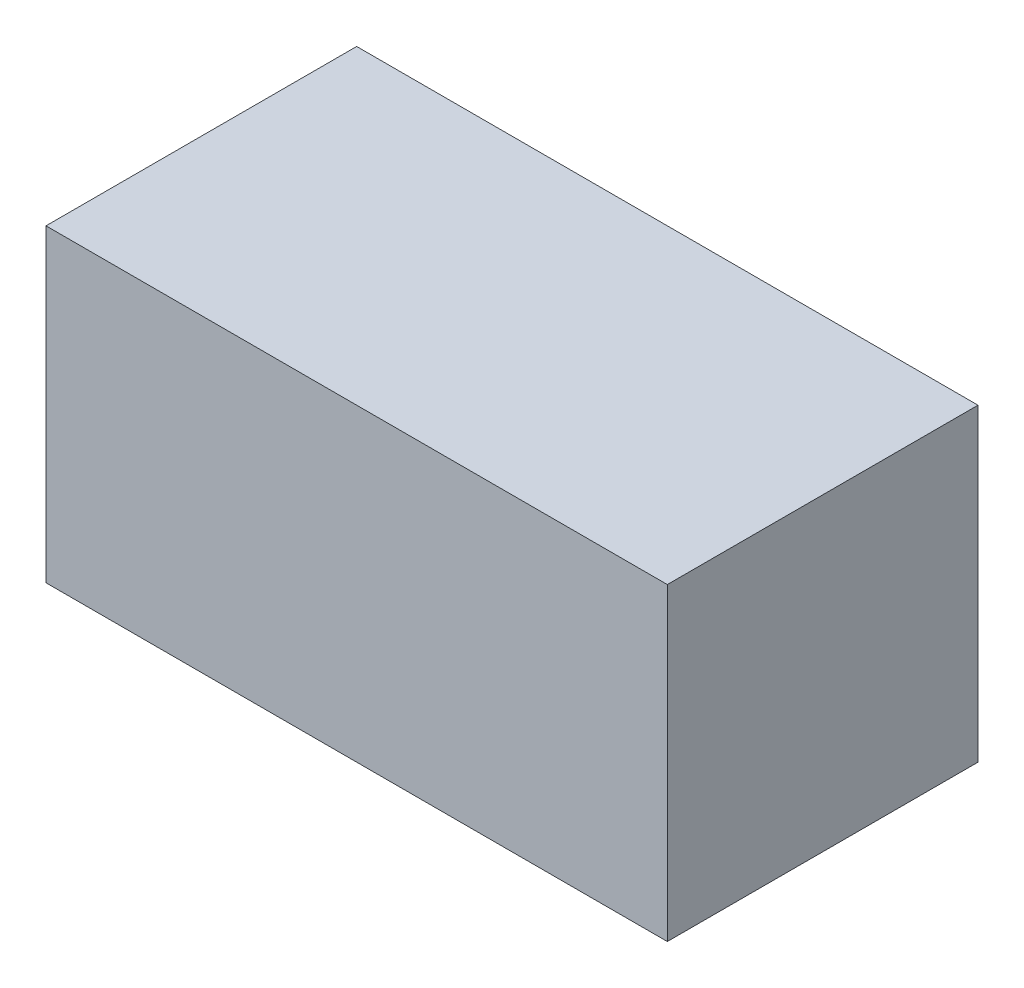
ISO-10303-21;
HEADER;
FILE_DESCRIPTION(('STEP AP214'),'2;1');
FILE_NAME('part.step','',(''),(''),'','','');
FILE_SCHEMA(('AUTOMOTIVE_DESIGN { 1 0 10303 214 1 1 1 1 }'));
ENDSEC;
DATA;
#1=APPLICATION_CONTEXT('core data for automotive mechanical design processes');
#2=APPLICATION_PROTOCOL_DEFINITION('international standard','automotive_design',2000,#1);
#3=PRODUCT_CONTEXT('',#1,'mechanical');
#4=PRODUCT('Part','Part','',(#3));
#5=PRODUCT_RELATED_PRODUCT_CATEGORY('part','',(#4));
#6=PRODUCT_DEFINITION_FORMATION('','',#4);
#7=PRODUCT_DEFINITION_CONTEXT('part definition',#1,'design');
#8=PRODUCT_DEFINITION('design','',#6,#7);
#9=PRODUCT_DEFINITION_SHAPE('','',#8);
#10=(LENGTH_UNIT() NAMED_UNIT(*) SI_UNIT(.MILLI.,.METRE.));
#11=(NAMED_UNIT(*) PLANE_ANGLE_UNIT() SI_UNIT($,.RADIAN.));
#12=(NAMED_UNIT(*) SI_UNIT($,.STERADIAN.) SOLID_ANGLE_UNIT());
#13=UNCERTAINTY_MEASURE_WITH_UNIT(LENGTH_MEASURE(1.E-05),#10,'distance_accuracy_value','');
#14=(GEOMETRIC_REPRESENTATION_CONTEXT(3) GLOBAL_UNCERTAINTY_ASSIGNED_CONTEXT((#13)) GLOBAL_UNIT_ASSIGNED_CONTEXT((#10,
#11,#12)) REPRESENTATION_CONTEXT('',''));
#15=CARTESIAN_POINT('',(0.,0.,0.));
#16=DIRECTION('',(0.,0.,1.));
#17=DIRECTION('',(1.,0.,0.));
#18=AXIS2_PLACEMENT_3D('',#15,#16,#17);
#19=CARTESIAN_POINT('',(0.499999,0.248793,0.));
#20=DIRECTION('',(0.,-1.,0.));
#21=DIRECTION('',(0.,0.,-1.));
#22=AXIS2_PLACEMENT_3D('',#19,#20,#21);
#23=PLANE('',#22);
#24=DIRECTION('',(0.,0.,-1.));
#25=VECTOR('',#24,1.);
#26=CARTESIAN_POINT('',(-0.499999,0.248793,0.));
#27=LINE('',#26,#25);
#28=CARTESIAN_POINT('',(-0.499999,0.248793,0.));
#29=VERTEX_POINT('',#28);
#30=CARTESIAN_POINT('',(-0.499999,0.248793,0.499999));
#31=VERTEX_POINT('',#30);
#32=EDGE_CURVE('E20',#29,#31,#27,.F.);
#33=ORIENTED_EDGE('',*,*,#32,.T.);
#34=DIRECTION('',(-1.,0.,0.));
#35=VECTOR('',#34,1.);
#36=CARTESIAN_POINT('',(-0.499999,0.248793,0.499999));
#37=LINE('',#36,#35);
#38=CARTESIAN_POINT('',(0.499999,0.248793,0.499999));
#39=VERTEX_POINT('',#38);
#40=EDGE_CURVE('E55',#31,#39,#37,.F.);
#41=ORIENTED_EDGE('',*,*,#40,.T.);
#42=DIRECTION('',(0.,0.,1.));
#43=VECTOR('',#42,1.);
#44=CARTESIAN_POINT('',(0.499999,0.248793,0.));
#45=LINE('',#44,#43);
#46=CARTESIAN_POINT('',(0.499999,0.248793,0.));
#47=VERTEX_POINT('',#46);
#48=EDGE_CURVE('E74',#39,#47,#45,.F.);
#49=ORIENTED_EDGE('',*,*,#48,.T.);
#50=DIRECTION('',(-1.,0.,0.));
#51=VECTOR('',#50,1.);
#52=CARTESIAN_POINT('',(-0.499999,0.248793,0.));
#53=LINE('',#52,#51);
#54=EDGE_CURVE('E66',#29,#47,#53,.F.);
#55=ORIENTED_EDGE('',*,*,#54,.F.);
#56=EDGE_LOOP('',(#33,#41,#49,#55));
#57=FACE_BOUND('',#56,.T.);
#58=ADVANCED_FACE('F17',(#57),#23,.F.);
#59=CARTESIAN_POINT('',(-0.499999,0.248793,0.));
#60=DIRECTION('',(1.,0.,0.));
#61=DIRECTION('',(0.,0.,-1.));
#62=AXIS2_PLACEMENT_3D('',#59,#60,#61);
#63=PLANE('',#62);
#64=DIRECTION('',(0.,0.,1.));
#65=VECTOR('',#64,1.);
#66=CARTESIAN_POINT('',(-0.499999,-0.248793,0.));
#67=LINE('',#66,#65);
#68=CARTESIAN_POINT('',(-0.499999,-0.248793,0.));
#69=VERTEX_POINT('',#68);
#70=CARTESIAN_POINT('',(-0.499999,-0.248793,0.499999));
#71=VERTEX_POINT('',#70);
#72=EDGE_CURVE('E72',#69,#71,#67,.T.);
#73=ORIENTED_EDGE('',*,*,#72,.T.);
#74=DIRECTION('',(0.,1.,0.));
#75=VECTOR('',#74,1.);
#76=CARTESIAN_POINT('',(-0.499999,0.248793,0.499999));
#77=LINE('',#76,#75);
#78=EDGE_CURVE('E62',#71,#31,#77,.T.);
#79=ORIENTED_EDGE('',*,*,#78,.T.);
#80=ORIENTED_EDGE('',*,*,#32,.F.);
#81=DIRECTION('',(0.,1.,0.));
#82=VECTOR('',#81,1.);
#83=CARTESIAN_POINT('',(-0.499999,0.248793,0.));
#84=LINE('',#83,#82);
#85=EDGE_CURVE('E80',#69,#29,#84,.T.);
#86=ORIENTED_EDGE('',*,*,#85,.F.);
#87=EDGE_LOOP('',(#73,#79,#80,#86));
#88=FACE_BOUND('',#87,.T.);
#89=ADVANCED_FACE('F71',(#88),#63,.F.);
#90=CARTESIAN_POINT('',(-0.499999,0.248793,0.499999));
#91=DIRECTION('',(0.,0.,-1.));
#92=DIRECTION('',(-1.,0.,0.));
#93=AXIS2_PLACEMENT_3D('',#90,#91,#92);
#94=PLANE('',#93);
#95=DIRECTION('',(1.,0.,0.));
#96=VECTOR('',#95,1.);
#97=CARTESIAN_POINT('',(-0.499999,-0.248793,0.499999));
#98=LINE('',#97,#96);
#99=CARTESIAN_POINT('',(0.499999,-0.248793,0.499999));
#100=VERTEX_POINT('',#99);
#101=EDGE_CURVE('E83',#71,#100,#98,.T.);
#102=ORIENTED_EDGE('',*,*,#101,.T.);
#103=DIRECTION('',(0.,1.,0.));
#104=VECTOR('',#103,1.);
#105=CARTESIAN_POINT('',(0.499999,-0.248793,0.499999));
#106=LINE('',#105,#104);
#107=EDGE_CURVE('E64',#100,#39,#106,.T.);
#108=ORIENTED_EDGE('',*,*,#107,.T.);
#109=ORIENTED_EDGE('',*,*,#40,.F.);
#110=ORIENTED_EDGE('',*,*,#78,.F.);
#111=EDGE_LOOP('',(#102,#108,#109,#110));
#112=FACE_BOUND('',#111,.T.);
#113=ADVANCED_FACE('F60',(#112),#94,.F.);
#114=CARTESIAN_POINT('',(0.499999,-0.248793,0.));
#115=DIRECTION('',(-1.,0.,0.));
#116=DIRECTION('',(0.,0.,1.));
#117=AXIS2_PLACEMENT_3D('',#114,#115,#116);
#118=PLANE('',#117);
#119=ORIENTED_EDGE('',*,*,#48,.F.);
#120=ORIENTED_EDGE('',*,*,#107,.F.);
#121=DIRECTION('',(0.,0.,1.));
#122=VECTOR('',#121,1.);
#123=CARTESIAN_POINT('',(0.499999,-0.248793,0.));
#124=LINE('',#123,#122);
#125=CARTESIAN_POINT('',(0.499999,-0.248793,0.));
#126=VERTEX_POINT('',#125);
#127=EDGE_CURVE('E26',#100,#126,#124,.F.);
#128=ORIENTED_EDGE('',*,*,#127,.T.);
#129=DIRECTION('',(0.,1.,0.));
#130=VECTOR('',#129,1.);
#131=CARTESIAN_POINT('',(0.499999,0.248793,0.));
#132=LINE('',#131,#130);
#133=EDGE_CURVE('E34',#47,#126,#132,.F.);
#134=ORIENTED_EDGE('',*,*,#133,.F.);
#135=EDGE_LOOP('',(#119,#120,#128,#134));
#136=FACE_BOUND('',#135,.T.);
#137=ADVANCED_FACE('F88',(#136),#118,.F.);
#138=CARTESIAN_POINT('',(-0.499999,0.248793,0.));
#139=DIRECTION('',(0.,0.,-1.));
#140=DIRECTION('',(-1.,0.,0.));
#141=AXIS2_PLACEMENT_3D('',#138,#139,#140);
#142=PLANE('',#141);
#143=DIRECTION('',(1.,0.,0.));
#144=VECTOR('',#143,1.);
#145=CARTESIAN_POINT('',(-0.499999,-0.248793,0.));
#146=LINE('',#145,#144);
#147=EDGE_CURVE('E11',#126,#69,#146,.F.);
#148=ORIENTED_EDGE('',*,*,#147,.T.);
#149=ORIENTED_EDGE('',*,*,#85,.T.);
#150=ORIENTED_EDGE('',*,*,#54,.T.);
#151=ORIENTED_EDGE('',*,*,#133,.T.);
#152=EDGE_LOOP('',(#148,#149,#150,#151));
#153=FACE_BOUND('',#152,.T.);
#154=ADVANCED_FACE('F91',(#153),#142,.T.);
#155=CARTESIAN_POINT('',(-0.499999,-0.248793,0.));
#156=DIRECTION('',(0.,1.,0.));
#157=DIRECTION('',(0.,0.,1.));
#158=AXIS2_PLACEMENT_3D('',#155,#156,#157);
#159=PLANE('',#158);
#160=ORIENTED_EDGE('',*,*,#127,.F.);
#161=ORIENTED_EDGE('',*,*,#101,.F.);
#162=ORIENTED_EDGE('',*,*,#72,.F.);
#163=ORIENTED_EDGE('',*,*,#147,.F.);
#164=EDGE_LOOP('',(#160,#161,#162,#163));
#165=FACE_BOUND('',#164,.T.);
#166=ADVANCED_FACE('F90',(#165),#159,.F.);
#167=CLOSED_SHELL('',(#58,#89,#113,#137,#154,#166));
#168=MANIFOLD_SOLID_BREP('B1',#167);
#169=ADVANCED_BREP_SHAPE_REPRESENTATION('',(#18,#168),#14);
#170=SHAPE_DEFINITION_REPRESENTATION(#9,#169);
ENDSEC;
END-ISO-10303-21;
